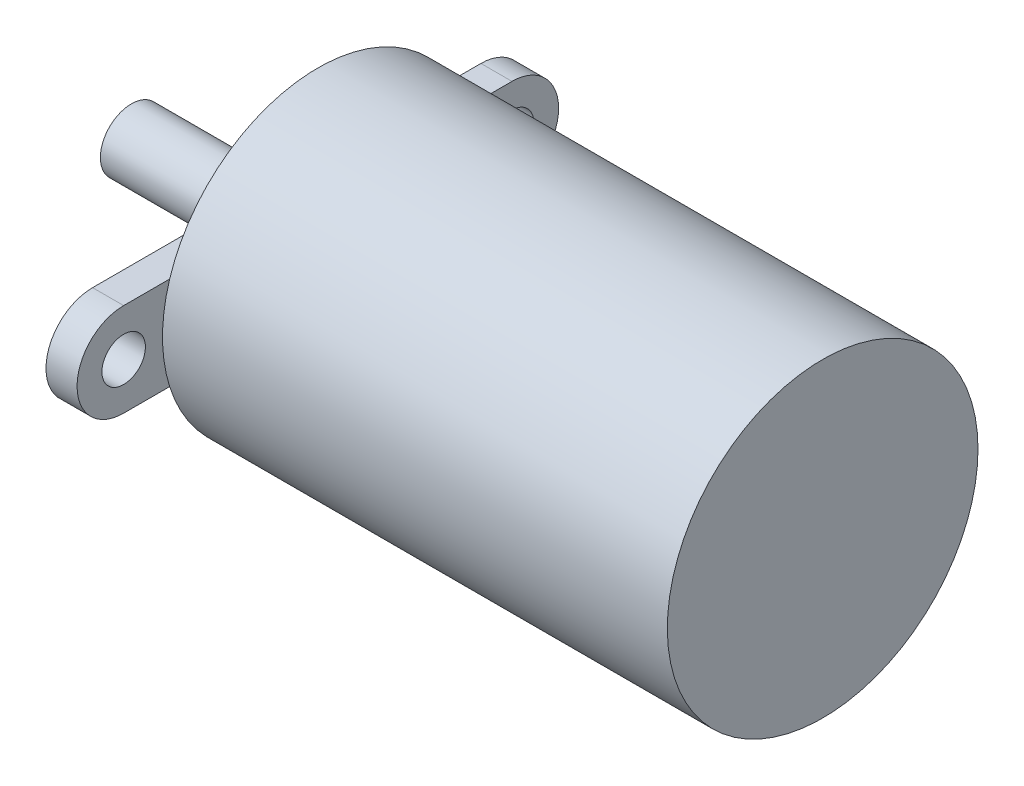
ISO-10303-21;
HEADER;
FILE_DESCRIPTION(('STEP AP214'),'2;1');
FILE_NAME('part.step','',(''),(''),'','','');
FILE_SCHEMA(('AUTOMOTIVE_DESIGN { 1 0 10303 214 1 1 1 1 }'));
ENDSEC;
DATA;
#1=APPLICATION_CONTEXT('core data for automotive mechanical design processes');
#2=APPLICATION_PROTOCOL_DEFINITION('international standard','automotive_design',2000,#1);
#3=PRODUCT_CONTEXT('',#1,'mechanical');
#4=PRODUCT('Part','Part','',(#3));
#5=PRODUCT_RELATED_PRODUCT_CATEGORY('part','',(#4));
#6=PRODUCT_DEFINITION_FORMATION('','',#4);
#7=PRODUCT_DEFINITION_CONTEXT('part definition',#1,'design');
#8=PRODUCT_DEFINITION('design','',#6,#7);
#9=PRODUCT_DEFINITION_SHAPE('','',#8);
#10=(LENGTH_UNIT() NAMED_UNIT(*) SI_UNIT(.MILLI.,.METRE.));
#11=(NAMED_UNIT(*) PLANE_ANGLE_UNIT() SI_UNIT($,.RADIAN.));
#12=(NAMED_UNIT(*) SI_UNIT($,.STERADIAN.) SOLID_ANGLE_UNIT());
#13=UNCERTAINTY_MEASURE_WITH_UNIT(LENGTH_MEASURE(1.E-05),#10,'distance_accuracy_value','');
#14=(GEOMETRIC_REPRESENTATION_CONTEXT(3) GLOBAL_UNCERTAINTY_ASSIGNED_CONTEXT((#13)) GLOBAL_UNIT_ASSIGNED_CONTEXT((#10,
#11,#12)) REPRESENTATION_CONTEXT('',''));
#15=CARTESIAN_POINT('',(0.,0.,0.));
#16=DIRECTION('',(0.,0.,1.));
#17=DIRECTION('',(1.,0.,0.));
#18=AXIS2_PLACEMENT_3D('',#15,#16,#17);
#19=CARTESIAN_POINT('',(-4.,0.,0.));
#20=DIRECTION('',(-1.,0.,0.));
#21=DIRECTION('',(0.,0.,1.));
#22=AXIS2_PLACEMENT_3D('',#19,#20,#21);
#23=PLANE('',#22);
#24=CARTESIAN_POINT('',(-4.,0.,0.));
#25=DIRECTION('',(-1.,0.,0.));
#26=DIRECTION('',(0.,0.,1.));
#27=AXIS2_PLACEMENT_3D('',#24,#25,#26);
#28=CIRCLE('',#27,4.);
#29=CARTESIAN_POINT('',(-4.,0.,4.));
#30=VERTEX_POINT('',#29);
#31=EDGE_CURVE('E126',#30,#30,#28,.T.);
#32=ORIENTED_EDGE('',*,*,#31,.T.);
#33=EDGE_LOOP('',(#32));
#34=FACE_BOUND('',#33,.T.);
#35=CARTESIAN_POINT('',(-4.,0.,0.));
#36=DIRECTION('',(-1.,0.,0.));
#37=DIRECTION('',(0.,0.,1.));
#38=AXIS2_PLACEMENT_3D('',#35,#36,#37);
#39=CIRCLE('',#38,2.);
#40=CARTESIAN_POINT('',(-4.,0.,2.));
#41=VERTEX_POINT('',#40);
#42=EDGE_CURVE('E382',#41,#41,#39,.T.);
#43=ORIENTED_EDGE('',*,*,#42,.F.);
#44=EDGE_LOOP('',(#43));
#45=FACE_BOUND('',#44,.T.);
#46=ADVANCED_FACE('F35',(#34,#45),#23,.T.);
#47=CARTESIAN_POINT('',(-2.,0.,-12.5));
#48=DIRECTION('',(-1.,0.,0.));
#49=DIRECTION('',(0.,0.,1.));
#50=AXIS2_PLACEMENT_3D('',#47,#48,#49);
#51=PLANE('',#50);
#52=CARTESIAN_POINT('',(-2.,0.,0.));
#53=DIRECTION('',(-1.,0.,0.));
#54=DIRECTION('',(0.,0.,1.));
#55=AXIS2_PLACEMENT_3D('',#52,#53,#54);
#56=CIRCLE('',#55,4.);
#57=CARTESIAN_POINT('',(-2.,3.00000000000001,-2.64575131106458));
#58=VERTEX_POINT('',#57);
#59=CARTESIAN_POINT('',(-2.,-3.,-2.64575131106459));
#60=VERTEX_POINT('',#59);
#61=EDGE_CURVE('E11',#58,#60,#56,.T.);
#62=ORIENTED_EDGE('',*,*,#61,.F.);
#63=DIRECTION('',(0.,0.,-1.));
#64=VECTOR('',#63,1.);
#65=CARTESIAN_POINT('',(-2.,3.00000000000001,-12.5));
#66=LINE('',#65,#64);
#67=CARTESIAN_POINT('',(-2.,3.00000000000001,-12.5));
#68=VERTEX_POINT('',#67);
#69=EDGE_CURVE('E111',#58,#68,#66,.T.);
#70=ORIENTED_EDGE('',*,*,#69,.T.);
#71=CARTESIAN_POINT('',(-2.,0.,-12.5));
#72=DIRECTION('',(-1.,0.,0.));
#73=DIRECTION('',(0.,0.,1.));
#74=AXIS2_PLACEMENT_3D('',#71,#72,#73);
#75=CIRCLE('',#74,3.00000000000001);
#76=CARTESIAN_POINT('',(-2.,-3.00000000000001,-12.5));
#77=VERTEX_POINT('',#76);
#78=EDGE_CURVE('E145',#68,#77,#75,.T.);
#79=ORIENTED_EDGE('',*,*,#78,.T.);
#80=DIRECTION('',(0.,0.,1.));
#81=VECTOR('',#80,1.);
#82=CARTESIAN_POINT('',(-2.,-3.00000000000001,-12.5));
#83=LINE('',#82,#81);
#84=EDGE_CURVE('E150',#77,#60,#83,.T.);
#85=ORIENTED_EDGE('',*,*,#84,.T.);
#86=EDGE_LOOP('',(#62,#70,#79,#85));
#87=FACE_BOUND('',#86,.T.);
#88=CARTESIAN_POINT('',(-2.,0.,-12.5));
#89=DIRECTION('',(-1.,0.,0.));
#90=DIRECTION('',(0.,0.,1.));
#91=AXIS2_PLACEMENT_3D('',#88,#89,#90);
#92=CIRCLE('',#91,1.39999999999999);
#93=CARTESIAN_POINT('',(-2.,0.,-11.1));
#94=VERTEX_POINT('',#93);
#95=EDGE_CURVE('E128',#94,#94,#92,.T.);
#96=ORIENTED_EDGE('',*,*,#95,.F.);
#97=EDGE_LOOP('',(#96));
#98=FACE_BOUND('',#97,.T.);
#99=ADVANCED_FACE('F207',(#87,#98),#51,.T.);
#100=CARTESIAN_POINT('',(0.,0.,0.));
#101=DIRECTION('',(1.,0.,0.));
#102=DIRECTION('',(0.,0.,-1.));
#103=AXIS2_PLACEMENT_3D('',#100,#101,#102);
#104=PLANE('',#103);
#105=DIRECTION('',(0.,0.,-1.));
#106=VECTOR('',#105,1.);
#107=CARTESIAN_POINT('',(0.,3.00000000000001,-12.5));
#108=LINE('',#107,#106);
#109=CARTESIAN_POINT('',(0.,3.00000000000001,9.53939201416946));
#110=VERTEX_POINT('',#109);
#111=CARTESIAN_POINT('',(0.,3.00000000000001,-9.53939201416946));
#112=VERTEX_POINT('',#111);
#113=EDGE_CURVE('E124',#110,#112,#108,.T.);
#114=ORIENTED_EDGE('',*,*,#113,.F.);
#115=CARTESIAN_POINT('',(0.,0.,0.));
#116=DIRECTION('',(1.,0.,0.));
#117=DIRECTION('',(0.,0.,-1.));
#118=AXIS2_PLACEMENT_3D('',#115,#116,#117);
#119=CIRCLE('',#118,10.);
#120=EDGE_CURVE('E39',#112,#110,#119,.T.);
#121=ORIENTED_EDGE('',*,*,#120,.F.);
#122=EDGE_LOOP('',(#114,#121));
#123=FACE_BOUND('',#122,.T.);
#124=ADVANCED_FACE('F204',(#123),#104,.F.);
#125=DIRECTION('',(0.,0.,1.));
#126=VECTOR('',#125,1.);
#127=CARTESIAN_POINT('',(0.,-3.00000000000001,-12.5));
#128=LINE('',#127,#126);
#129=CARTESIAN_POINT('',(0.,-3.,-9.53939201416946));
#130=VERTEX_POINT('',#129);
#131=CARTESIAN_POINT('',(0.,-3.,9.53939201416946));
#132=VERTEX_POINT('',#131);
#133=EDGE_CURVE('E161',#130,#132,#128,.T.);
#134=ORIENTED_EDGE('',*,*,#133,.F.);
#135=EDGE_CURVE('E185',#132,#130,#119,.T.);
#136=ORIENTED_EDGE('',*,*,#135,.F.);
#137=EDGE_LOOP('',(#134,#136));
#138=FACE_BOUND('',#137,.T.);
#139=ADVANCED_FACE('F206',(#138),#104,.F.);
#140=CARTESIAN_POINT('',(32.5,0.,0.));
#141=DIRECTION('',(-1.,0.,0.));
#142=DIRECTION('',(0.,0.,1.));
#143=AXIS2_PLACEMENT_3D('',#140,#141,#142);
#144=CYLINDRICAL_SURFACE('',#143,10.);
#145=CARTESIAN_POINT('',(32.5,0.,0.));
#146=DIRECTION('',(1.,0.,0.));
#147=DIRECTION('',(0.,0.,-1.));
#148=AXIS2_PLACEMENT_3D('',#145,#146,#147);
#149=CIRCLE('',#148,10.);
#150=CARTESIAN_POINT('',(32.5,0.,-10.));
#151=VERTEX_POINT('',#150);
#152=EDGE_CURVE('E175',#151,#151,#149,.T.);
#153=ORIENTED_EDGE('',*,*,#152,.F.);
#154=EDGE_LOOP('',(#153));
#155=FACE_BOUND('',#154,.T.);
#156=ORIENTED_EDGE('',*,*,#120,.T.);
#157=EDGE_CURVE('E181',#110,#132,#119,.T.);
#158=ORIENTED_EDGE('',*,*,#157,.T.);
#159=ORIENTED_EDGE('',*,*,#135,.T.);
#160=EDGE_CURVE('E174',#130,#112,#119,.T.);
#161=ORIENTED_EDGE('',*,*,#160,.T.);
#162=EDGE_LOOP('',(#156,#158,#159,#161));
#163=FACE_BOUND('',#162,.T.);
#164=ADVANCED_FACE('F37',(#155,#163),#144,.T.);
#165=CARTESIAN_POINT('',(32.5,0.,0.));
#166=DIRECTION('',(1.,0.,0.));
#167=DIRECTION('',(0.,0.,-1.));
#168=AXIS2_PLACEMENT_3D('',#165,#166,#167);
#169=PLANE('',#168);
#170=ORIENTED_EDGE('',*,*,#152,.T.);
#171=EDGE_LOOP('',(#170));
#172=FACE_BOUND('',#171,.T.);
#173=ADVANCED_FACE('F253',(#172),#169,.T.);
#174=CARTESIAN_POINT('',(0.,0.,-12.5));
#175=DIRECTION('',(-1.,0.,0.));
#176=DIRECTION('',(0.,0.,1.));
#177=AXIS2_PLACEMENT_3D('',#174,#175,#176);
#178=PLANE('',#177);
#179=CARTESIAN_POINT('',(0.,0.,12.5));
#180=DIRECTION('',(-1.,0.,0.));
#181=DIRECTION('',(0.,0.,1.));
#182=AXIS2_PLACEMENT_3D('',#179,#180,#181);
#183=CIRCLE('',#182,1.39999999999999);
#184=CARTESIAN_POINT('',(0.,0.,13.9));
#185=VERTEX_POINT('',#184);
#186=EDGE_CURVE('E141',#185,#185,#183,.T.);
#187=ORIENTED_EDGE('',*,*,#186,.T.);
#188=EDGE_LOOP('',(#187));
#189=FACE_BOUND('',#188,.T.);
#190=ORIENTED_EDGE('',*,*,#157,.F.);
#191=CARTESIAN_POINT('',(0.,3.00000000000001,12.5));
#192=VERTEX_POINT('',#191);
#193=EDGE_CURVE('E149',#192,#110,#108,.T.);
#194=ORIENTED_EDGE('',*,*,#193,.F.);
#195=CARTESIAN_POINT('',(0.,0.,12.5));
#196=DIRECTION('',(-1.,0.,0.));
#197=DIRECTION('',(0.,0.,1.));
#198=AXIS2_PLACEMENT_3D('',#195,#196,#197);
#199=CIRCLE('',#198,3.00000000000001);
#200=CARTESIAN_POINT('',(0.,-3.,12.5));
#201=VERTEX_POINT('',#200);
#202=EDGE_CURVE('E160',#201,#192,#199,.T.);
#203=ORIENTED_EDGE('',*,*,#202,.F.);
#204=EDGE_CURVE('E156',#132,#201,#128,.T.);
#205=ORIENTED_EDGE('',*,*,#204,.F.);
#206=EDGE_LOOP('',(#190,#194,#203,#205));
#207=FACE_BOUND('',#206,.T.);
#208=ADVANCED_FACE('F243',(#189,#207),#178,.F.);
#209=CARTESIAN_POINT('',(-2.,0.,-12.5));
#210=DIRECTION('',(1.,0.,0.));
#211=DIRECTION('',(0.,0.,-1.));
#212=AXIS2_PLACEMENT_3D('',#209,#210,#211);
#213=CYLINDRICAL_SURFACE('',#212,3.00000000000001);
#214=CARTESIAN_POINT('',(0.,0.,-12.5));
#215=DIRECTION('',(-1.,0.,0.));
#216=DIRECTION('',(0.,0.,1.));
#217=AXIS2_PLACEMENT_3D('',#214,#215,#216);
#218=CIRCLE('',#217,3.00000000000001);
#219=CARTESIAN_POINT('',(0.,3.00000000000001,-12.5));
#220=VERTEX_POINT('',#219);
#221=CARTESIAN_POINT('',(0.,-3.00000000000001,-12.5));
#222=VERTEX_POINT('',#221);
#223=EDGE_CURVE('E144',#220,#222,#218,.T.);
#224=ORIENTED_EDGE('',*,*,#223,.T.);
#225=DIRECTION('',(1.,0.,0.));
#226=VECTOR('',#225,1.);
#227=CARTESIAN_POINT('',(-2.,-3.00000000000001,-12.5));
#228=LINE('',#227,#226);
#229=EDGE_CURVE('E172',#77,#222,#228,.T.);
#230=ORIENTED_EDGE('',*,*,#229,.F.);
#231=ORIENTED_EDGE('',*,*,#78,.F.);
#232=DIRECTION('',(1.,0.,0.));
#233=VECTOR('',#232,1.);
#234=CARTESIAN_POINT('',(-2.,3.00000000000001,-12.5));
#235=LINE('',#234,#233);
#236=EDGE_CURVE('E108',#68,#220,#235,.T.);
#237=ORIENTED_EDGE('',*,*,#236,.T.);
#238=EDGE_LOOP('',(#224,#230,#231,#237));
#239=FACE_BOUND('',#238,.T.);
#240=ADVANCED_FACE('F201',(#239),#213,.T.);
#241=CARTESIAN_POINT('',(-2.,-3.00000000000001,-12.5));
#242=DIRECTION('',(0.,1.,0.));
#243=DIRECTION('',(0.,0.,1.));
#244=AXIS2_PLACEMENT_3D('',#241,#242,#243);
#245=PLANE('',#244);
#246=EDGE_CURVE('E157',#222,#130,#128,.T.);
#247=ORIENTED_EDGE('',*,*,#246,.T.);
#248=ORIENTED_EDGE('',*,*,#133,.T.);
#249=ORIENTED_EDGE('',*,*,#204,.T.);
#250=DIRECTION('',(1.,0.,0.));
#251=VECTOR('',#250,1.);
#252=CARTESIAN_POINT('',(-2.,-3.,12.5));
#253=LINE('',#252,#251);
#254=CARTESIAN_POINT('',(-2.,-3.,12.5));
#255=VERTEX_POINT('',#254);
#256=EDGE_CURVE('E169',#255,#201,#253,.T.);
#257=ORIENTED_EDGE('',*,*,#256,.F.);
#258=CARTESIAN_POINT('',(-2.,-3.,2.64575131106459));
#259=VERTEX_POINT('',#258);
#260=EDGE_CURVE('E148',#259,#255,#83,.T.);
#261=ORIENTED_EDGE('',*,*,#260,.F.);
#262=EDGE_CURVE('E152',#60,#259,#83,.T.);
#263=ORIENTED_EDGE('',*,*,#262,.F.);
#264=ORIENTED_EDGE('',*,*,#84,.F.);
#265=ORIENTED_EDGE('',*,*,#229,.T.);
#266=EDGE_LOOP('',(#247,#248,#249,#257,#261,#263,#264,#265));
#267=FACE_BOUND('',#266,.T.);
#268=ADVANCED_FACE('F197',(#267),#245,.F.);
#269=CARTESIAN_POINT('',(-2.,0.,12.5));
#270=DIRECTION('',(1.,0.,0.));
#271=DIRECTION('',(0.,0.,-1.));
#272=AXIS2_PLACEMENT_3D('',#269,#270,#271);
#273=CYLINDRICAL_SURFACE('',#272,3.00000000000001);
#274=ORIENTED_EDGE('',*,*,#202,.T.);
#275=DIRECTION('',(1.,0.,0.));
#276=VECTOR('',#275,1.);
#277=CARTESIAN_POINT('',(-2.,3.00000000000001,12.5));
#278=LINE('',#277,#276);
#279=CARTESIAN_POINT('',(-2.,3.00000000000001,12.5));
#280=VERTEX_POINT('',#279);
#281=EDGE_CURVE('E167',#280,#192,#278,.T.);
#282=ORIENTED_EDGE('',*,*,#281,.F.);
#283=CARTESIAN_POINT('',(-2.,0.,12.5));
#284=DIRECTION('',(-1.,0.,0.));
#285=DIRECTION('',(0.,0.,1.));
#286=AXIS2_PLACEMENT_3D('',#283,#284,#285);
#287=CIRCLE('',#286,3.00000000000001);
#288=EDGE_CURVE('E104',#255,#280,#287,.T.);
#289=ORIENTED_EDGE('',*,*,#288,.F.);
#290=ORIENTED_EDGE('',*,*,#256,.T.);
#291=EDGE_LOOP('',(#274,#282,#289,#290));
#292=FACE_BOUND('',#291,.T.);
#293=ADVANCED_FACE('F246',(#292),#273,.T.);
#294=CARTESIAN_POINT('',(-2.,3.00000000000001,-12.5));
#295=DIRECTION('',(0.,-1.,0.));
#296=DIRECTION('',(0.,0.,-1.));
#297=AXIS2_PLACEMENT_3D('',#294,#295,#296);
#298=PLANE('',#297);
#299=ORIENTED_EDGE('',*,*,#193,.T.);
#300=ORIENTED_EDGE('',*,*,#113,.T.);
#301=EDGE_CURVE('E163',#112,#220,#108,.T.);
#302=ORIENTED_EDGE('',*,*,#301,.T.);
#303=ORIENTED_EDGE('',*,*,#236,.F.);
#304=ORIENTED_EDGE('',*,*,#69,.F.);
#305=CARTESIAN_POINT('',(-2.,3.00000000000001,2.64575131106458));
#306=VERTEX_POINT('',#305);
#307=EDGE_CURVE('E109',#306,#58,#66,.T.);
#308=ORIENTED_EDGE('',*,*,#307,.F.);
#309=EDGE_CURVE('E99',#280,#306,#66,.T.);
#310=ORIENTED_EDGE('',*,*,#309,.F.);
#311=ORIENTED_EDGE('',*,*,#281,.T.);
#312=EDGE_LOOP('',(#299,#300,#302,#303,#304,#308,#310,#311));
#313=FACE_BOUND('',#312,.T.);
#314=ADVANCED_FACE('F114',(#313),#298,.F.);
#315=EDGE_CURVE('E44',#259,#306,#56,.T.);
#316=ORIENTED_EDGE('',*,*,#315,.F.);
#317=ORIENTED_EDGE('',*,*,#260,.T.);
#318=ORIENTED_EDGE('',*,*,#288,.T.);
#319=ORIENTED_EDGE('',*,*,#309,.T.);
#320=EDGE_LOOP('',(#316,#317,#318,#319));
#321=FACE_BOUND('',#320,.T.);
#322=CARTESIAN_POINT('',(-2.,0.,12.5));
#323=DIRECTION('',(-1.,0.,0.));
#324=DIRECTION('',(0.,0.,1.));
#325=AXIS2_PLACEMENT_3D('',#322,#323,#324);
#326=CIRCLE('',#325,1.39999999999999);
#327=CARTESIAN_POINT('',(-2.,0.,13.9));
#328=VERTEX_POINT('',#327);
#329=EDGE_CURVE('E138',#328,#328,#326,.T.);
#330=ORIENTED_EDGE('',*,*,#329,.F.);
#331=EDGE_LOOP('',(#330));
#332=FACE_BOUND('',#331,.T.);
#333=ADVANCED_FACE('F101',(#321,#332),#51,.T.);
#334=CARTESIAN_POINT('',(0.,0.,-12.5));
#335=DIRECTION('',(-1.,0.,0.));
#336=DIRECTION('',(0.,0.,1.));
#337=AXIS2_PLACEMENT_3D('',#334,#335,#336);
#338=CIRCLE('',#337,1.39999999999999);
#339=CARTESIAN_POINT('',(0.,0.,-11.1));
#340=VERTEX_POINT('',#339);
#341=EDGE_CURVE('E135',#340,#340,#338,.T.);
#342=ORIENTED_EDGE('',*,*,#341,.T.);
#343=EDGE_LOOP('',(#342));
#344=FACE_BOUND('',#343,.T.);
#345=ORIENTED_EDGE('',*,*,#160,.F.);
#346=ORIENTED_EDGE('',*,*,#246,.F.);
#347=ORIENTED_EDGE('',*,*,#223,.F.);
#348=ORIENTED_EDGE('',*,*,#301,.F.);
#349=EDGE_LOOP('',(#345,#346,#347,#348));
#350=FACE_BOUND('',#349,.T.);
#351=ADVANCED_FACE('F193',(#344,#350),#178,.F.);
#352=CARTESIAN_POINT('',(-2.,0.,12.5));
#353=DIRECTION('',(-1.,0.,0.));
#354=DIRECTION('',(0.,0.,1.));
#355=AXIS2_PLACEMENT_3D('',#352,#353,#354);
#356=CYLINDRICAL_SURFACE('',#355,1.39999999999999);
#357=ORIENTED_EDGE('',*,*,#329,.T.);
#358=EDGE_LOOP('',(#357));
#359=FACE_BOUND('',#358,.T.);
#360=ORIENTED_EDGE('',*,*,#186,.F.);
#361=EDGE_LOOP('',(#360));
#362=FACE_BOUND('',#361,.T.);
#363=ADVANCED_FACE('F234',(#359,#362),#356,.F.);
#364=CARTESIAN_POINT('',(-2.,0.,-12.5));
#365=DIRECTION('',(-1.,0.,0.));
#366=DIRECTION('',(0.,0.,1.));
#367=AXIS2_PLACEMENT_3D('',#364,#365,#366);
#368=CYLINDRICAL_SURFACE('',#367,1.39999999999999);
#369=ORIENTED_EDGE('',*,*,#95,.T.);
#370=EDGE_LOOP('',(#369));
#371=FACE_BOUND('',#370,.T.);
#372=ORIENTED_EDGE('',*,*,#341,.F.);
#373=EDGE_LOOP('',(#372));
#374=FACE_BOUND('',#373,.T.);
#375=ADVANCED_FACE('F227',(#371,#374),#368,.F.);
#376=CARTESIAN_POINT('',(-2.,0.,0.));
#377=DIRECTION('',(-1.,0.,0.));
#378=DIRECTION('',(0.,0.,1.));
#379=AXIS2_PLACEMENT_3D('',#376,#377,#378);
#380=PLANE('',#379);
#381=EDGE_CURVE('E46',#60,#259,#56,.T.);
#382=ORIENTED_EDGE('',*,*,#381,.F.);
#383=ORIENTED_EDGE('',*,*,#262,.T.);
#384=EDGE_LOOP('',(#382,#383));
#385=FACE_BOUND('',#384,.T.);
#386=ADVANCED_FACE('F224',(#385),#380,.F.);
#387=EDGE_CURVE('E122',#306,#58,#56,.T.);
#388=ORIENTED_EDGE('',*,*,#387,.F.);
#389=ORIENTED_EDGE('',*,*,#307,.T.);
#390=EDGE_LOOP('',(#388,#389));
#391=FACE_BOUND('',#390,.T.);
#392=ADVANCED_FACE('F125',(#391),#380,.F.);
#393=CARTESIAN_POINT('',(-4.,0.,0.));
#394=DIRECTION('',(1.,0.,0.));
#395=DIRECTION('',(0.,0.,-1.));
#396=AXIS2_PLACEMENT_3D('',#393,#394,#395);
#397=CYLINDRICAL_SURFACE('',#396,4.);
#398=ORIENTED_EDGE('',*,*,#31,.F.);
#399=EDGE_LOOP('',(#398));
#400=FACE_BOUND('',#399,.T.);
#401=ORIENTED_EDGE('',*,*,#387,.T.);
#402=ORIENTED_EDGE('',*,*,#61,.T.);
#403=ORIENTED_EDGE('',*,*,#381,.T.);
#404=ORIENTED_EDGE('',*,*,#315,.T.);
#405=EDGE_LOOP('',(#401,#402,#403,#404));
#406=FACE_BOUND('',#405,.T.);
#407=ADVANCED_FACE('F121',(#400,#406),#397,.T.);
#408=CARTESIAN_POINT('',(-12.,0.,0.));
#409=DIRECTION('',(1.,0.,0.));
#410=DIRECTION('',(0.,0.,-1.));
#411=AXIS2_PLACEMENT_3D('',#408,#409,#410);
#412=CYLINDRICAL_SURFACE('',#411,2.);
#413=CARTESIAN_POINT('',(-12.,0.,0.));
#414=DIRECTION('',(-1.,0.,0.));
#415=DIRECTION('',(0.,0.,1.));
#416=AXIS2_PLACEMENT_3D('',#413,#414,#415);
#417=CIRCLE('',#416,2.);
#418=CARTESIAN_POINT('',(-12.,0.,2.));
#419=VERTEX_POINT('',#418);
#420=EDGE_CURVE('E130',#419,#419,#417,.T.);
#421=ORIENTED_EDGE('',*,*,#420,.F.);
#422=EDGE_LOOP('',(#421));
#423=FACE_BOUND('',#422,.T.);
#424=ORIENTED_EDGE('',*,*,#42,.T.);
#425=EDGE_LOOP('',(#424));
#426=FACE_BOUND('',#425,.T.);
#427=ADVANCED_FACE('F222',(#423,#426),#412,.T.);
#428=CARTESIAN_POINT('',(-12.,0.,0.));
#429=DIRECTION('',(-1.,0.,0.));
#430=DIRECTION('',(0.,0.,1.));
#431=AXIS2_PLACEMENT_3D('',#428,#429,#430);
#432=PLANE('',#431);
#433=ORIENTED_EDGE('',*,*,#420,.T.);
#434=EDGE_LOOP('',(#433));
#435=FACE_BOUND('',#434,.T.);
#436=ADVANCED_FACE('F357',(#435),#432,.T.);
#437=CLOSED_SHELL('',(#46,#99,#124,#139,#164,#173,#208,#240,#268,#293,#314,#333,#351,#363,#375,
#386,#392,#407,#427,#436));
#438=MANIFOLD_SOLID_BREP('B2',#437);
#439=ADVANCED_BREP_SHAPE_REPRESENTATION('',(#18,#438),#14);
#440=SHAPE_DEFINITION_REPRESENTATION(#9,#439);
ENDSEC;
END-ISO-10303-21;
